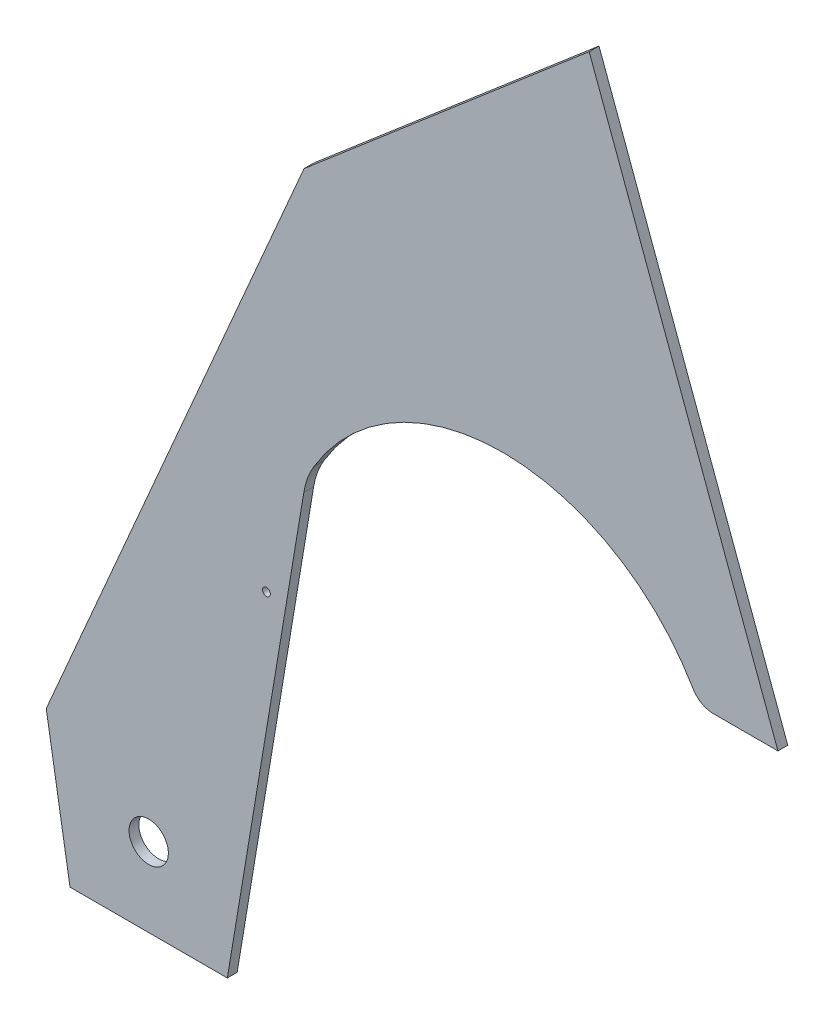
ISO-10303-21;
HEADER;
FILE_DESCRIPTION(('STEP AP214'),'2;1');
FILE_NAME('part.step','',(''),(''),'','','');
FILE_SCHEMA(('AUTOMOTIVE_DESIGN { 1 0 10303 214 1 1 1 1 }'));
ENDSEC;
DATA;
#1=APPLICATION_CONTEXT('core data for automotive mechanical design processes');
#2=APPLICATION_PROTOCOL_DEFINITION('international standard','automotive_design',2000,#1);
#3=PRODUCT_CONTEXT('',#1,'mechanical');
#4=PRODUCT('Part','Part','',(#3));
#5=PRODUCT_RELATED_PRODUCT_CATEGORY('part','',(#4));
#6=PRODUCT_DEFINITION_FORMATION('','',#4);
#7=PRODUCT_DEFINITION_CONTEXT('part definition',#1,'design');
#8=PRODUCT_DEFINITION('design','',#6,#7);
#9=PRODUCT_DEFINITION_SHAPE('','',#8);
#10=(LENGTH_UNIT() NAMED_UNIT(*) SI_UNIT(.MILLI.,.METRE.));
#11=(NAMED_UNIT(*) PLANE_ANGLE_UNIT() SI_UNIT($,.RADIAN.));
#12=(NAMED_UNIT(*) SI_UNIT($,.STERADIAN.) SOLID_ANGLE_UNIT());
#13=UNCERTAINTY_MEASURE_WITH_UNIT(LENGTH_MEASURE(1.E-05),#10,'distance_accuracy_value','');
#14=(GEOMETRIC_REPRESENTATION_CONTEXT(3) GLOBAL_UNCERTAINTY_ASSIGNED_CONTEXT((#13)) GLOBAL_UNIT_ASSIGNED_CONTEXT((#10,
#11,#12)) REPRESENTATION_CONTEXT('',''));
#15=CARTESIAN_POINT('',(0.,0.,0.));
#16=DIRECTION('',(0.,0.,1.));
#17=DIRECTION('',(1.,0.,0.));
#18=AXIS2_PLACEMENT_3D('',#15,#16,#17);
#19=CARTESIAN_POINT('',(139.7,120.371818659187,3.175));
#20=DIRECTION('',(0.,0.,-1.));
#21=DIRECTION('',(-1.,0.,0.));
#22=AXIS2_PLACEMENT_3D('',#19,#20,#21);
#23=PLANE('',#22);
#24=CARTESIAN_POINT('',(63.4124096554344,114.3,3.175));
#25=DIRECTION('',(0.,0.,-1.));
#26=DIRECTION('',(-1.,0.,0.));
#27=AXIS2_PLACEMENT_3D('',#24,#25,#26);
#28=CIRCLE('',#27,1.26999999999999);
#29=CARTESIAN_POINT('',(62.1424096554344,114.3,3.175));
#30=VERTEX_POINT('',#29);
#31=EDGE_CURVE('E139',#30,#30,#28,.T.);
#32=ORIENTED_EDGE('',*,*,#31,.T.);
#33=EDGE_LOOP('',(#32));
#34=FACE_BOUND('',#33,.T.);
#35=DIRECTION('',(0.164398987305358,0.986393923832144,0.));
#36=VECTOR('',#35,1.);
#37=CARTESIAN_POINT('',(76.2000000000001,152.4,3.175));
#38=LINE('',#37,#36);
#39=CARTESIAN_POINT('',(50.8,0.,3.175));
#40=VERTEX_POINT('',#39);
#41=CARTESIAN_POINT('',(75.4927051174178,148.156230704506,3.175));
#42=VERTEX_POINT('',#41);
#43=EDGE_CURVE('E151',#40,#42,#38,.T.);
#44=ORIENTED_EDGE('',*,*,#43,.T.);
#45=CARTESIAN_POINT('',(100.547110782754,143.98049642695,3.175));
#46=DIRECTION('',(0.,0.,-1.));
#47=DIRECTION('',(-1.,0.,0.));
#48=AXIS2_PLACEMENT_3D('',#45,#46,#47);
#49=CIRCLE('',#48,25.4);
#50=CARTESIAN_POINT('',(78.7955056620621,157.096428520152,3.175));
#51=VERTEX_POINT('',#50);
#52=EDGE_CURVE('E11',#42,#51,#49,.T.);
#53=ORIENTED_EDGE('',*,*,#52,.T.);
#54=CARTESIAN_POINT('',(139.7,120.371818659187,3.175));
#55=DIRECTION('',(0.,0.,-1.));
#56=DIRECTION('',(-1.,0.,0.));
#57=AXIS2_PLACEMENT_3D('',#54,#55,#56);
#58=CIRCLE('',#57,71.12);
#59=CARTESIAN_POINT('',(201.145976407585,156.183079225083,3.175));
#60=VERTEX_POINT('',#59);
#61=EDGE_CURVE('E161',#51,#60,#58,.T.);
#62=ORIENTED_EDGE('',*,*,#61,.T.);
#63=CARTESIAN_POINT('',(207.729473879827,160.02,3.175));
#64=DIRECTION('',(0.,0.,-1.));
#65=DIRECTION('',(-1.,0.,0.));
#66=AXIS2_PLACEMENT_3D('',#63,#64,#65);
#67=CIRCLE('',#66,7.62);
#68=CARTESIAN_POINT('',(207.729473879827,152.4,3.175));
#69=VERTEX_POINT('',#68);
#70=EDGE_CURVE('E219',#60,#69,#67,.F.);
#71=ORIENTED_EDGE('',*,*,#70,.T.);
#72=DIRECTION('',(1.,0.,0.));
#73=VECTOR('',#72,1.);
#74=CARTESIAN_POINT('',(203.2,152.4,3.175));
#75=LINE('',#74,#73);
#76=CARTESIAN_POINT('',(228.6,152.4,3.175));
#77=VERTEX_POINT('',#76);
#78=EDGE_CURVE('E164',#69,#77,#75,.T.);
#79=ORIENTED_EDGE('',*,*,#78,.T.);
#80=DIRECTION('',(-0.346403874495462,0.938085473576119,0.));
#81=VECTOR('',#80,1.);
#82=CARTESIAN_POINT('',(228.6,152.4,3.175));
#83=LINE('',#82,#81);
#84=CARTESIAN_POINT('',(167.642212713142,317.477872868576,3.175));
#85=VERTEX_POINT('',#84);
#86=EDGE_CURVE('E167',#77,#85,#83,.T.);
#87=ORIENTED_EDGE('',*,*,#86,.T.);
#88=DIRECTION('',(-0.760008711469065,-0.649912885309356,0.));
#89=VECTOR('',#88,1.);
#90=CARTESIAN_POINT('',(-25.4,152.4,3.175));
#91=LINE('',#90,#89);
#92=CARTESIAN_POINT('',(75.5676708355718,238.741365941544,3.175));
#93=VERTEX_POINT('',#92);
#94=EDGE_CURVE('E137',#85,#93,#91,.T.);
#95=ORIENTED_EDGE('',*,*,#94,.T.);
#96=DIRECTION('',(0.396734019208051,0.917933613069609,0.));
#97=VECTOR('',#96,1.);
#98=CARTESIAN_POINT('',(86.2393540790386,263.432711485252,3.175));
#99=LINE('',#98,#97);
#100=CARTESIAN_POINT('',(-7.68590685005017,46.1154411003013,3.175));
#101=VERTEX_POINT('',#100);
#102=EDGE_CURVE('E121',#101,#93,#99,.T.);
#103=ORIENTED_EDGE('',*,*,#102,.F.);
#104=DIRECTION('',(0.164398987305357,-0.986393923832144,0.));
#105=VECTOR('',#104,1.);
#106=CARTESIAN_POINT('',(-25.4,152.4,3.175));
#107=LINE('',#106,#105);
#108=CARTESIAN_POINT('',(0.,0.,3.175));
#109=VERTEX_POINT('',#108);
#110=EDGE_CURVE('E134',#101,#109,#107,.T.);
#111=ORIENTED_EDGE('',*,*,#110,.T.);
#112=DIRECTION('',(1.,0.,0.));
#113=VECTOR('',#112,1.);
#114=CARTESIAN_POINT('',(0.,0.,3.175));
#115=LINE('',#114,#113);
#116=EDGE_CURVE('E146',#109,#40,#115,.T.);
#117=ORIENTED_EDGE('',*,*,#116,.T.);
#118=EDGE_LOOP('',(#44,#53,#62,#71,#79,#87,#95,#103,#111,#117));
#119=FACE_BOUND('',#118,.T.);
#120=CARTESIAN_POINT('',(25.4,25.4,3.175));
#121=DIRECTION('',(0.,0.,1.));
#122=DIRECTION('',(1.,0.,0.));
#123=AXIS2_PLACEMENT_3D('',#120,#121,#122);
#124=CIRCLE('',#123,6.35000000000001);
#125=CARTESIAN_POINT('',(31.75,25.4,3.175));
#126=VERTEX_POINT('',#125);
#127=EDGE_CURVE('E177',#126,#126,#124,.T.);
#128=ORIENTED_EDGE('',*,*,#127,.F.);
#129=EDGE_LOOP('',(#128));
#130=FACE_BOUND('',#129,.T.);
#131=ADVANCED_FACE('F41',(#34,#119,#130),#23,.F.);
#132=CARTESIAN_POINT('',(139.7,120.371818659187,0.));
#133=DIRECTION('',(0.,0.,-1.));
#134=DIRECTION('',(-1.,0.,0.));
#135=AXIS2_PLACEMENT_3D('',#132,#133,#134);
#136=PLANE('',#135);
#137=CARTESIAN_POINT('',(63.4124096554344,114.3,0.));
#138=DIRECTION('',(0.,0.,-1.));
#139=DIRECTION('',(-1.,0.,0.));
#140=AXIS2_PLACEMENT_3D('',#137,#138,#139);
#141=CIRCLE('',#140,1.26999999999999);
#142=CARTESIAN_POINT('',(62.1424096554344,114.3,0.));
#143=VERTEX_POINT('',#142);
#144=EDGE_CURVE('E258',#143,#143,#141,.T.);
#145=ORIENTED_EDGE('',*,*,#144,.F.);
#146=EDGE_LOOP('',(#145));
#147=FACE_BOUND('',#146,.T.);
#148=DIRECTION('',(1.,0.,0.));
#149=VECTOR('',#148,1.);
#150=CARTESIAN_POINT('',(203.2,152.4,0.));
#151=LINE('',#150,#149);
#152=CARTESIAN_POINT('',(207.729473879827,152.4,0.));
#153=VERTEX_POINT('',#152);
#154=CARTESIAN_POINT('',(228.6,152.4,0.));
#155=VERTEX_POINT('',#154);
#156=EDGE_CURVE('E186',#153,#155,#151,.T.);
#157=ORIENTED_EDGE('',*,*,#156,.F.);
#158=CARTESIAN_POINT('',(207.729473879827,160.02,0.));
#159=DIRECTION('',(0.,0.,-1.));
#160=DIRECTION('',(-1.,0.,0.));
#161=AXIS2_PLACEMENT_3D('',#158,#159,#160);
#162=CIRCLE('',#161,7.62);
#163=CARTESIAN_POINT('',(201.145976407585,156.183079225083,0.));
#164=VERTEX_POINT('',#163);
#165=EDGE_CURVE('E211',#153,#164,#162,.T.);
#166=ORIENTED_EDGE('',*,*,#165,.T.);
#167=CARTESIAN_POINT('',(139.7,120.371818659187,0.));
#168=DIRECTION('',(0.,0.,-1.));
#169=DIRECTION('',(-1.,0.,0.));
#170=AXIS2_PLACEMENT_3D('',#167,#168,#169);
#171=CIRCLE('',#170,71.12);
#172=CARTESIAN_POINT('',(78.7955056620621,157.096428520152,0.));
#173=VERTEX_POINT('',#172);
#174=EDGE_CURVE('E183',#173,#164,#171,.T.);
#175=ORIENTED_EDGE('',*,*,#174,.F.);
#176=CARTESIAN_POINT('',(100.547110782754,143.98049642695,0.));
#177=DIRECTION('',(0.,0.,-1.));
#178=DIRECTION('',(-1.,0.,0.));
#179=AXIS2_PLACEMENT_3D('',#176,#177,#178);
#180=CIRCLE('',#179,25.4);
#181=CARTESIAN_POINT('',(75.4927051174178,148.156230704506,0.));
#182=VERTEX_POINT('',#181);
#183=EDGE_CURVE('E50',#173,#182,#180,.F.);
#184=ORIENTED_EDGE('',*,*,#183,.T.);
#185=DIRECTION('',(0.164398987305358,0.986393923832144,0.));
#186=VECTOR('',#185,1.);
#187=CARTESIAN_POINT('',(76.2000000000001,152.4,0.));
#188=LINE('',#187,#186);
#189=CARTESIAN_POINT('',(50.8,0.,0.));
#190=VERTEX_POINT('',#189);
#191=EDGE_CURVE('E180',#190,#182,#188,.T.);
#192=ORIENTED_EDGE('',*,*,#191,.F.);
#193=DIRECTION('',(1.,0.,0.));
#194=VECTOR('',#193,1.);
#195=CARTESIAN_POINT('',(0.,0.,0.));
#196=LINE('',#195,#194);
#197=CARTESIAN_POINT('',(0.,0.,0.));
#198=VERTEX_POINT('',#197);
#199=EDGE_CURVE('E176',#198,#190,#196,.T.);
#200=ORIENTED_EDGE('',*,*,#199,.F.);
#201=DIRECTION('',(0.164398987305357,-0.986393923832144,0.));
#202=VECTOR('',#201,1.);
#203=CARTESIAN_POINT('',(-25.4,152.4,0.));
#204=LINE('',#203,#202);
#205=CARTESIAN_POINT('',(-7.68590685005017,46.1154411003013,0.));
#206=VERTEX_POINT('',#205);
#207=EDGE_CURVE('E173',#206,#198,#204,.T.);
#208=ORIENTED_EDGE('',*,*,#207,.F.);
#209=DIRECTION('',(0.396734019208051,0.917933613069609,0.));
#210=VECTOR('',#209,1.);
#211=CARTESIAN_POINT('',(86.2393540790386,263.432711485252,0.));
#212=LINE('',#211,#210);
#213=CARTESIAN_POINT('',(75.5676708355718,238.741365941544,0.));
#214=VERTEX_POINT('',#213);
#215=EDGE_CURVE('E124',#206,#214,#212,.T.);
#216=ORIENTED_EDGE('',*,*,#215,.T.);
#217=DIRECTION('',(-0.760008711469065,-0.649912885309356,0.));
#218=VECTOR('',#217,1.);
#219=CARTESIAN_POINT('',(-25.4,152.4,0.));
#220=LINE('',#219,#218);
#221=CARTESIAN_POINT('',(167.642212713142,317.477872868576,0.));
#222=VERTEX_POINT('',#221);
#223=EDGE_CURVE('E147',#222,#214,#220,.T.);
#224=ORIENTED_EDGE('',*,*,#223,.F.);
#225=DIRECTION('',(-0.346403874495462,0.938085473576119,0.));
#226=VECTOR('',#225,1.);
#227=CARTESIAN_POINT('',(228.6,152.4,0.));
#228=LINE('',#227,#226);
#229=EDGE_CURVE('E154',#155,#222,#228,.T.);
#230=ORIENTED_EDGE('',*,*,#229,.F.);
#231=EDGE_LOOP('',(#157,#166,#175,#184,#192,#200,#208,#216,#224,#230));
#232=FACE_BOUND('',#231,.T.);
#233=CARTESIAN_POINT('',(25.4,25.4,0.));
#234=DIRECTION('',(0.,0.,1.));
#235=DIRECTION('',(1.,0.,0.));
#236=AXIS2_PLACEMENT_3D('',#233,#234,#235);
#237=CIRCLE('',#236,6.35000000000001);
#238=CARTESIAN_POINT('',(31.75,25.4,0.));
#239=VERTEX_POINT('',#238);
#240=EDGE_CURVE('E129',#239,#239,#237,.T.);
#241=ORIENTED_EDGE('',*,*,#240,.T.);
#242=EDGE_LOOP('',(#241));
#243=FACE_BOUND('',#242,.T.);
#244=ADVANCED_FACE('F235',(#147,#232,#243),#136,.T.);
#245=CARTESIAN_POINT('',(-25.4,152.4,3.175));
#246=DIRECTION('',(0.986393923832144,0.164398987305357,0.));
#247=DIRECTION('',(-0.164398987305357,0.986393923832144,0.));
#248=AXIS2_PLACEMENT_3D('',#245,#246,#247);
#249=PLANE('',#248);
#250=ORIENTED_EDGE('',*,*,#110,.F.);
#251=DIRECTION('',(0.,0.,-1.));
#252=VECTOR('',#251,1.);
#253=CARTESIAN_POINT('',(-7.68590685005019,46.1154411003012,3.175));
#254=LINE('',#253,#252);
#255=EDGE_CURVE('E118',#101,#206,#254,.T.);
#256=ORIENTED_EDGE('',*,*,#255,.T.);
#257=ORIENTED_EDGE('',*,*,#207,.T.);
#258=DIRECTION('',(0.,0.,-1.));
#259=VECTOR('',#258,1.);
#260=CARTESIAN_POINT('',(0.,0.,3.175));
#261=LINE('',#260,#259);
#262=EDGE_CURVE('E144',#109,#198,#261,.T.);
#263=ORIENTED_EDGE('',*,*,#262,.F.);
#264=EDGE_LOOP('',(#250,#256,#257,#263));
#265=FACE_BOUND('',#264,.T.);
#266=ADVANCED_FACE('F142',(#265),#249,.F.);
#267=CARTESIAN_POINT('',(0.,0.,3.175));
#268=DIRECTION('',(0.,1.,0.));
#269=DIRECTION('',(0.,0.,1.));
#270=AXIS2_PLACEMENT_3D('',#267,#268,#269);
#271=PLANE('',#270);
#272=ORIENTED_EDGE('',*,*,#199,.T.);
#273=DIRECTION('',(0.,0.,-1.));
#274=VECTOR('',#273,1.);
#275=CARTESIAN_POINT('',(50.8,0.,3.175));
#276=LINE('',#275,#274);
#277=EDGE_CURVE('E198',#40,#190,#276,.T.);
#278=ORIENTED_EDGE('',*,*,#277,.F.);
#279=ORIENTED_EDGE('',*,*,#116,.F.);
#280=ORIENTED_EDGE('',*,*,#262,.T.);
#281=EDGE_LOOP('',(#272,#278,#279,#280));
#282=FACE_BOUND('',#281,.T.);
#283=ADVANCED_FACE('F296',(#282),#271,.F.);
#284=CARTESIAN_POINT('',(76.2000000000001,152.4,3.175));
#285=DIRECTION('',(-0.986393923832144,0.164398987305358,0.));
#286=DIRECTION('',(-0.164398987305358,-0.986393923832144,0.));
#287=AXIS2_PLACEMENT_3D('',#284,#285,#286);
#288=PLANE('',#287);
#289=ORIENTED_EDGE('',*,*,#191,.T.);
#290=DIRECTION('',(0.,0.,1.));
#291=VECTOR('',#290,1.);
#292=CARTESIAN_POINT('',(75.4927051174178,148.156230704506,3.175));
#293=LINE('',#292,#291);
#294=EDGE_CURVE('E57',#182,#42,#293,.T.);
#295=ORIENTED_EDGE('',*,*,#294,.T.);
#296=ORIENTED_EDGE('',*,*,#43,.F.);
#297=ORIENTED_EDGE('',*,*,#277,.T.);
#298=EDGE_LOOP('',(#289,#295,#296,#297));
#299=FACE_BOUND('',#298,.T.);
#300=ADVANCED_FACE('F293',(#299),#288,.F.);
#301=CARTESIAN_POINT('',(139.7,120.371818659187,3.175));
#302=DIRECTION('',(0.,0.,-1.));
#303=DIRECTION('',(-1.,0.,0.));
#304=AXIS2_PLACEMENT_3D('',#301,#302,#303);
#305=CYLINDRICAL_SURFACE('',#304,71.12);
#306=ORIENTED_EDGE('',*,*,#61,.F.);
#307=DIRECTION('',(0.,0.,-1.));
#308=VECTOR('',#307,1.);
#309=CARTESIAN_POINT('',(78.7955056620621,157.096428520152,3.175));
#310=LINE('',#309,#308);
#311=EDGE_CURVE('E222',#51,#173,#310,.T.);
#312=ORIENTED_EDGE('',*,*,#311,.T.);
#313=ORIENTED_EDGE('',*,*,#174,.T.);
#314=DIRECTION('',(0.,0.,-1.));
#315=VECTOR('',#314,1.);
#316=CARTESIAN_POINT('',(201.145976407585,156.183079225083,3.175));
#317=LINE('',#316,#315);
#318=EDGE_CURVE('E215',#164,#60,#317,.F.);
#319=ORIENTED_EDGE('',*,*,#318,.T.);
#320=EDGE_LOOP('',(#306,#312,#313,#319));
#321=FACE_BOUND('',#320,.T.);
#322=ADVANCED_FACE('F231',(#321),#305,.F.);
#323=CARTESIAN_POINT('',(203.2,152.4,3.175));
#324=DIRECTION('',(0.,1.,0.));
#325=DIRECTION('',(-1.,0.,0.));
#326=AXIS2_PLACEMENT_3D('',#323,#324,#325);
#327=PLANE('',#326);
#328=ORIENTED_EDGE('',*,*,#78,.F.);
#329=DIRECTION('',(0.,0.,-1.));
#330=VECTOR('',#329,1.);
#331=CARTESIAN_POINT('',(207.729473879827,152.4,3.175));
#332=LINE('',#331,#330);
#333=EDGE_CURVE('E207',#69,#153,#332,.T.);
#334=ORIENTED_EDGE('',*,*,#333,.T.);
#335=ORIENTED_EDGE('',*,*,#156,.T.);
#336=DIRECTION('',(0.,0.,-1.));
#337=VECTOR('',#336,1.);
#338=CARTESIAN_POINT('',(228.6,152.4,3.175));
#339=LINE('',#338,#337);
#340=EDGE_CURVE('E194',#77,#155,#339,.T.);
#341=ORIENTED_EDGE('',*,*,#340,.F.);
#342=EDGE_LOOP('',(#328,#334,#335,#341));
#343=FACE_BOUND('',#342,.T.);
#344=ADVANCED_FACE('F246',(#343),#327,.F.);
#345=CARTESIAN_POINT('',(228.6,152.4,3.175));
#346=DIRECTION('',(-0.938085473576119,-0.346403874495462,0.));
#347=DIRECTION('',(0.346403874495462,-0.93808547357612,0.));
#348=AXIS2_PLACEMENT_3D('',#345,#346,#347);
#349=PLANE('',#348);
#350=ORIENTED_EDGE('',*,*,#229,.T.);
#351=DIRECTION('',(0.,0.,-1.));
#352=VECTOR('',#351,1.);
#353=CARTESIAN_POINT('',(167.642212713142,317.477872868576,3.175));
#354=LINE('',#353,#352);
#355=EDGE_CURVE('E172',#85,#222,#354,.T.);
#356=ORIENTED_EDGE('',*,*,#355,.F.);
#357=ORIENTED_EDGE('',*,*,#86,.F.);
#358=ORIENTED_EDGE('',*,*,#340,.T.);
#359=EDGE_LOOP('',(#350,#356,#357,#358));
#360=FACE_BOUND('',#359,.T.);
#361=ADVANCED_FACE('F250',(#360),#349,.F.);
#362=CARTESIAN_POINT('',(-25.4,152.4,3.175));
#363=DIRECTION('',(0.649912885309356,-0.760008711469065,0.));
#364=DIRECTION('',(0.760008711469065,0.649912885309356,0.));
#365=AXIS2_PLACEMENT_3D('',#362,#363,#364);
#366=PLANE('',#365);
#367=ORIENTED_EDGE('',*,*,#223,.T.);
#368=DIRECTION('',(0.,0.,1.));
#369=VECTOR('',#368,1.);
#370=CARTESIAN_POINT('',(75.5676708355716,238.741365941544,3.175));
#371=LINE('',#370,#369);
#372=EDGE_CURVE('E204',#214,#93,#371,.T.);
#373=ORIENTED_EDGE('',*,*,#372,.T.);
#374=ORIENTED_EDGE('',*,*,#94,.F.);
#375=ORIENTED_EDGE('',*,*,#355,.T.);
#376=EDGE_LOOP('',(#367,#373,#374,#375));
#377=FACE_BOUND('',#376,.T.);
#378=ADVANCED_FACE('F253',(#377),#366,.F.);
#379=CARTESIAN_POINT('',(25.4,25.4,3.175));
#380=DIRECTION('',(0.,0.,-1.));
#381=DIRECTION('',(-1.,0.,0.));
#382=AXIS2_PLACEMENT_3D('',#379,#380,#381);
#383=CYLINDRICAL_SURFACE('',#382,6.35000000000001);
#384=ORIENTED_EDGE('',*,*,#127,.T.);
#385=EDGE_LOOP('',(#384));
#386=FACE_BOUND('',#385,.T.);
#387=ORIENTED_EDGE('',*,*,#240,.F.);
#388=EDGE_LOOP('',(#387));
#389=FACE_BOUND('',#388,.T.);
#390=ADVANCED_FACE('F268',(#386,#389),#383,.F.);
#391=CARTESIAN_POINT('',(86.2393540790386,263.432711485252,0.));
#392=DIRECTION('',(0.917933613069608,-0.396734019208051,0.));
#393=DIRECTION('',(0.396734019208051,0.917933613069609,0.));
#394=AXIS2_PLACEMENT_3D('',#391,#392,#393);
#395=PLANE('',#394);
#396=ORIENTED_EDGE('',*,*,#102,.T.);
#397=ORIENTED_EDGE('',*,*,#372,.F.);
#398=ORIENTED_EDGE('',*,*,#215,.F.);
#399=ORIENTED_EDGE('',*,*,#255,.F.);
#400=EDGE_LOOP('',(#396,#397,#398,#399));
#401=FACE_BOUND('',#400,.T.);
#402=ADVANCED_FACE('F120',(#401),#395,.F.);
#403=CARTESIAN_POINT('',(207.729473879827,160.02,3.175));
#404=DIRECTION('',(0.,0.,-1.));
#405=DIRECTION('',(-1.,0.,0.));
#406=AXIS2_PLACEMENT_3D('',#403,#404,#405);
#407=CYLINDRICAL_SURFACE('',#406,7.62);
#408=ORIENTED_EDGE('',*,*,#70,.F.);
#409=ORIENTED_EDGE('',*,*,#318,.F.);
#410=ORIENTED_EDGE('',*,*,#165,.F.);
#411=ORIENTED_EDGE('',*,*,#333,.F.);
#412=EDGE_LOOP('',(#408,#409,#410,#411));
#413=FACE_BOUND('',#412,.T.);
#414=ADVANCED_FACE('F242',(#413),#407,.T.);
#415=CARTESIAN_POINT('',(100.547110782754,143.98049642695,3.175));
#416=DIRECTION('',(0.,0.,-1.));
#417=DIRECTION('',(-1.,0.,0.));
#418=AXIS2_PLACEMENT_3D('',#415,#416,#417);
#419=CYLINDRICAL_SURFACE('',#418,25.4);
#420=ORIENTED_EDGE('',*,*,#52,.F.);
#421=ORIENTED_EDGE('',*,*,#294,.F.);
#422=ORIENTED_EDGE('',*,*,#183,.F.);
#423=ORIENTED_EDGE('',*,*,#311,.F.);
#424=EDGE_LOOP('',(#420,#421,#422,#423));
#425=FACE_BOUND('',#424,.T.);
#426=ADVANCED_FACE('F43',(#425),#419,.F.);
#427=CARTESIAN_POINT('',(63.4124096554344,114.3,3.175));
#428=DIRECTION('',(0.,0.,-1.));
#429=DIRECTION('',(-1.,0.,0.));
#430=AXIS2_PLACEMENT_3D('',#427,#428,#429);
#431=CYLINDRICAL_SURFACE('',#430,1.26999999999999);
#432=ORIENTED_EDGE('',*,*,#31,.F.);
#433=EDGE_LOOP('',(#432));
#434=FACE_BOUND('',#433,.T.);
#435=ORIENTED_EDGE('',*,*,#144,.T.);
#436=EDGE_LOOP('',(#435));
#437=FACE_BOUND('',#436,.T.);
#438=ADVANCED_FACE('F305',(#434,#437),#431,.F.);
#439=CLOSED_SHELL('',(#131,#244,#266,#283,#300,#322,#344,#361,#378,#390,#402,#414,#426,#438));
#440=MANIFOLD_SOLID_BREP('B2',#439);
#441=ADVANCED_BREP_SHAPE_REPRESENTATION('',(#18,#440),#14);
#442=SHAPE_DEFINITION_REPRESENTATION(#9,#441);
ENDSEC;
END-ISO-10303-21;
